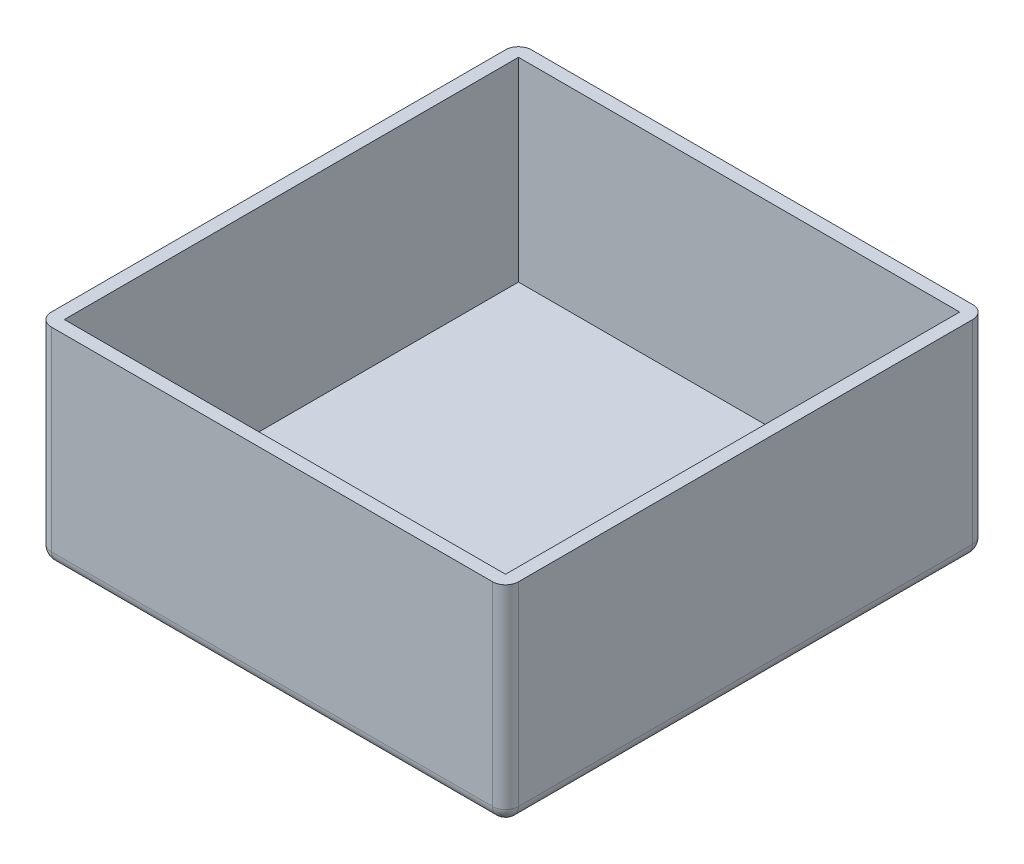
ISO-10303-21;
HEADER;
FILE_DESCRIPTION(('STEP AP214'),'2;1');
FILE_NAME('part.step','',(''),(''),'','','');
FILE_SCHEMA(('AUTOMOTIVE_DESIGN { 1 0 10303 214 1 1 1 1 }'));
ENDSEC;
DATA;
#1=APPLICATION_CONTEXT('core data for automotive mechanical design processes');
#2=APPLICATION_PROTOCOL_DEFINITION('international standard','automotive_design',2000,#1);
#3=PRODUCT_CONTEXT('',#1,'mechanical');
#4=PRODUCT('Part','Part','',(#3));
#5=PRODUCT_RELATED_PRODUCT_CATEGORY('part','',(#4));
#6=PRODUCT_DEFINITION_FORMATION('','',#4);
#7=PRODUCT_DEFINITION_CONTEXT('part definition',#1,'design');
#8=PRODUCT_DEFINITION('design','',#6,#7);
#9=PRODUCT_DEFINITION_SHAPE('','',#8);
#10=(LENGTH_UNIT() NAMED_UNIT(*) SI_UNIT(.MILLI.,.METRE.));
#11=(NAMED_UNIT(*) PLANE_ANGLE_UNIT() SI_UNIT($,.RADIAN.));
#12=(NAMED_UNIT(*) SI_UNIT($,.STERADIAN.) SOLID_ANGLE_UNIT());
#13=UNCERTAINTY_MEASURE_WITH_UNIT(LENGTH_MEASURE(1.E-05),#10,'distance_accuracy_value','');
#14=(GEOMETRIC_REPRESENTATION_CONTEXT(3) GLOBAL_UNCERTAINTY_ASSIGNED_CONTEXT((#13)) GLOBAL_UNIT_ASSIGNED_CONTEXT((#10,
#11,#12)) REPRESENTATION_CONTEXT('',''));
#15=CARTESIAN_POINT('',(0.,0.,0.));
#16=DIRECTION('',(0.,0.,1.));
#17=DIRECTION('',(1.,0.,0.));
#18=AXIS2_PLACEMENT_3D('',#15,#16,#17);
#19=CARTESIAN_POINT('',(-20.6822114521134,16.,-29.9549937691175));
#20=DIRECTION('',(1.,0.,0.));
#21=DIRECTION('',(0.,0.,-1.));
#22=AXIS2_PLACEMENT_3D('',#19,#20,#21);
#23=PLANE('',#22);
#24=DIRECTION('',(0.,0.,1.));
#25=VECTOR('',#24,1.);
#26=CARTESIAN_POINT('',(-20.6822114521134,1.,-29.9549937691175));
#27=LINE('',#26,#25);
#28=CARTESIAN_POINT('',(-20.6822114521134,1.,-28.9549937691175));
#29=VERTEX_POINT('',#28);
#30=CARTESIAN_POINT('',(-20.6822114521134,1.,6.04500623088252));
#31=VERTEX_POINT('',#30);
#32=EDGE_CURVE('E206',#29,#31,#27,.T.);
#33=ORIENTED_EDGE('',*,*,#32,.T.);
#34=DIRECTION('',(0.,-1.,0.));
#35=VECTOR('',#34,1.);
#36=CARTESIAN_POINT('',(-20.6822114521134,16.,6.04500623088252));
#37=LINE('',#36,#35);
#38=CARTESIAN_POINT('',(-20.6822114521134,16.,6.04500623088252));
#39=VERTEX_POINT('',#38);
#40=EDGE_CURVE('E208',#31,#39,#37,.F.);
#41=ORIENTED_EDGE('',*,*,#40,.T.);
#42=DIRECTION('',(0.,0.,1.));
#43=VECTOR('',#42,1.);
#44=CARTESIAN_POINT('',(-20.6822114521134,16.,-29.9549937691175));
#45=LINE('',#44,#43);
#46=CARTESIAN_POINT('',(-20.6822114521134,16.,-28.9549937691175));
#47=VERTEX_POINT('',#46);
#48=EDGE_CURVE('E173',#47,#39,#45,.T.);
#49=ORIENTED_EDGE('',*,*,#48,.F.);
#50=DIRECTION('',(0.,-1.,0.));
#51=VECTOR('',#50,1.);
#52=CARTESIAN_POINT('',(-20.6822114521134,16.,-28.9549937691175));
#53=LINE('',#52,#51);
#54=EDGE_CURVE('E204',#47,#29,#53,.T.);
#55=ORIENTED_EDGE('',*,*,#54,.T.);
#56=EDGE_LOOP('',(#33,#41,#49,#55));
#57=FACE_BOUND('',#56,.T.);
#58=ADVANCED_FACE('F33',(#57),#23,.F.);
#59=CARTESIAN_POINT('',(-20.6822114521134,16.,7.04500623088252));
#60=DIRECTION('',(0.,0.,-1.));
#61=DIRECTION('',(-1.,0.,0.));
#62=AXIS2_PLACEMENT_3D('',#59,#60,#61);
#63=PLANE('',#62);
#64=DIRECTION('',(1.,0.,0.));
#65=VECTOR('',#64,1.);
#66=CARTESIAN_POINT('',(-20.6822114521134,1.,7.04500623088252));
#67=LINE('',#66,#65);
#68=CARTESIAN_POINT('',(-19.6822114521134,1.,7.04500623088252));
#69=VERTEX_POINT('',#68);
#70=CARTESIAN_POINT('',(14.3177885478866,1.,7.04500623088252));
#71=VERTEX_POINT('',#70);
#72=EDGE_CURVE('E50',#69,#71,#67,.T.);
#73=ORIENTED_EDGE('',*,*,#72,.T.);
#74=DIRECTION('',(0.,-1.,0.));
#75=VECTOR('',#74,1.);
#76=CARTESIAN_POINT('',(14.3177885478866,16.,7.04500623088252));
#77=LINE('',#76,#75);
#78=CARTESIAN_POINT('',(14.3177885478866,16.,7.04500623088252));
#79=VERTEX_POINT('',#78);
#80=EDGE_CURVE('E218',#71,#79,#77,.F.);
#81=ORIENTED_EDGE('',*,*,#80,.T.);
#82=DIRECTION('',(1.,0.,0.));
#83=VECTOR('',#82,1.);
#84=CARTESIAN_POINT('',(-20.6822114521134,16.,7.04500623088252));
#85=LINE('',#84,#83);
#86=CARTESIAN_POINT('',(-19.6822114521134,16.,7.04500623088252));
#87=VERTEX_POINT('',#86);
#88=EDGE_CURVE('E179',#87,#79,#85,.T.);
#89=ORIENTED_EDGE('',*,*,#88,.F.);
#90=DIRECTION('',(0.,-1.,0.));
#91=VECTOR('',#90,1.);
#92=CARTESIAN_POINT('',(-19.6822114521134,16.,7.04500623088252));
#93=LINE('',#92,#91);
#94=EDGE_CURVE('E55',#87,#69,#93,.T.);
#95=ORIENTED_EDGE('',*,*,#94,.T.);
#96=EDGE_LOOP('',(#73,#81,#89,#95));
#97=FACE_BOUND('',#96,.T.);
#98=ADVANCED_FACE('F318',(#97),#63,.F.);
#99=CARTESIAN_POINT('',(15.3177885478866,16.,-29.9549937691175));
#100=DIRECTION('',(-1.,0.,0.));
#101=DIRECTION('',(0.,0.,1.));
#102=AXIS2_PLACEMENT_3D('',#99,#100,#101);
#103=PLANE('',#102);
#104=DIRECTION('',(0.,0.,-1.));
#105=VECTOR('',#104,1.);
#106=CARTESIAN_POINT('',(15.3177885478866,16.,-29.9549937691175));
#107=LINE('',#106,#105);
#108=CARTESIAN_POINT('',(15.3177885478866,16.,6.04500623088252));
#109=VERTEX_POINT('',#108);
#110=CARTESIAN_POINT('',(15.3177885478866,16.,-28.9549937691175));
#111=VERTEX_POINT('',#110);
#112=EDGE_CURVE('E182',#109,#111,#107,.T.);
#113=ORIENTED_EDGE('',*,*,#112,.F.);
#114=DIRECTION('',(0.,-1.,0.));
#115=VECTOR('',#114,1.);
#116=CARTESIAN_POINT('',(15.3177885478866,16.,6.04500623088252));
#117=LINE('',#116,#115);
#118=CARTESIAN_POINT('',(15.3177885478866,1.,6.04500623088252));
#119=VERTEX_POINT('',#118);
#120=EDGE_CURVE('E214',#109,#119,#117,.T.);
#121=ORIENTED_EDGE('',*,*,#120,.T.);
#122=DIRECTION('',(0.,0.,-1.));
#123=VECTOR('',#122,1.);
#124=CARTESIAN_POINT('',(15.3177885478866,1.,-29.9549937691175));
#125=LINE('',#124,#123);
#126=CARTESIAN_POINT('',(15.3177885478866,1.,-28.9549937691175));
#127=VERTEX_POINT('',#126);
#128=EDGE_CURVE('E212',#119,#127,#125,.T.);
#129=ORIENTED_EDGE('',*,*,#128,.T.);
#130=DIRECTION('',(0.,-1.,0.));
#131=VECTOR('',#130,1.);
#132=CARTESIAN_POINT('',(15.3177885478866,16.,-28.9549937691175));
#133=LINE('',#132,#131);
#134=EDGE_CURVE('E210',#127,#111,#133,.F.);
#135=ORIENTED_EDGE('',*,*,#134,.T.);
#136=EDGE_LOOP('',(#113,#121,#129,#135));
#137=FACE_BOUND('',#136,.T.);
#138=ADVANCED_FACE('F270',(#137),#103,.F.);
#139=CARTESIAN_POINT('',(-20.6822114521134,16.,-29.9549937691175));
#140=DIRECTION('',(0.,0.,1.));
#141=DIRECTION('',(1.,0.,0.));
#142=AXIS2_PLACEMENT_3D('',#139,#140,#141);
#143=PLANE('',#142);
#144=DIRECTION('',(-1.,0.,0.));
#145=VECTOR('',#144,1.);
#146=CARTESIAN_POINT('',(-20.6822114521134,16.,-29.9549937691175));
#147=LINE('',#146,#145);
#148=CARTESIAN_POINT('',(14.3177885478866,16.,-29.9549937691175));
#149=VERTEX_POINT('',#148);
#150=CARTESIAN_POINT('',(-19.6822114521134,16.,-29.9549937691175));
#151=VERTEX_POINT('',#150);
#152=EDGE_CURVE('E185',#149,#151,#147,.T.);
#153=ORIENTED_EDGE('',*,*,#152,.F.);
#154=DIRECTION('',(0.,-1.,0.));
#155=VECTOR('',#154,1.);
#156=CARTESIAN_POINT('',(14.3177885478866,16.,-29.9549937691175));
#157=LINE('',#156,#155);
#158=CARTESIAN_POINT('',(14.3177885478866,1.,-29.9549937691175));
#159=VERTEX_POINT('',#158);
#160=EDGE_CURVE('E193',#149,#159,#157,.T.);
#161=ORIENTED_EDGE('',*,*,#160,.T.);
#162=DIRECTION('',(-1.,0.,0.));
#163=VECTOR('',#162,1.);
#164=CARTESIAN_POINT('',(-20.6822114521134,1.,-29.9549937691175));
#165=LINE('',#164,#163);
#166=CARTESIAN_POINT('',(-19.6822114521134,1.,-29.9549937691175));
#167=VERTEX_POINT('',#166);
#168=EDGE_CURVE('E190',#159,#167,#165,.T.);
#169=ORIENTED_EDGE('',*,*,#168,.T.);
#170=DIRECTION('',(0.,-1.,0.));
#171=VECTOR('',#170,1.);
#172=CARTESIAN_POINT('',(-19.6822114521134,16.,-29.9549937691175));
#173=LINE('',#172,#171);
#174=EDGE_CURVE('E188',#167,#151,#173,.F.);
#175=ORIENTED_EDGE('',*,*,#174,.T.);
#176=EDGE_LOOP('',(#153,#161,#169,#175));
#177=FACE_BOUND('',#176,.T.);
#178=ADVANCED_FACE('F283',(#177),#143,.F.);
#179=CARTESIAN_POINT('',(0.,16.,0.));
#180=DIRECTION('',(0.,1.,0.));
#181=DIRECTION('',(0.,0.,1.));
#182=AXIS2_PLACEMENT_3D('',#179,#180,#181);
#183=PLANE('',#182);
#184=DIRECTION('',(0.,0.,1.));
#185=VECTOR('',#184,1.);
#186=CARTESIAN_POINT('',(-19.6822114521134,16.,-28.9549937691175));
#187=LINE('',#186,#185);
#188=CARTESIAN_POINT('',(-19.6822114521134,16.,-28.9549937691175));
#189=VERTEX_POINT('',#188);
#190=CARTESIAN_POINT('',(-19.6822114521134,16.,6.04500623088253));
#191=VERTEX_POINT('',#190);
#192=EDGE_CURVE('E141',#189,#191,#187,.T.);
#193=ORIENTED_EDGE('',*,*,#192,.F.);
#194=DIRECTION('',(-1.,0.,0.));
#195=VECTOR('',#194,1.);
#196=CARTESIAN_POINT('',(-19.6822114521134,16.,-28.9549937691175));
#197=LINE('',#196,#195);
#198=CARTESIAN_POINT('',(14.3177885478866,16.,-28.9549937691175));
#199=VERTEX_POINT('',#198);
#200=EDGE_CURVE('E158',#199,#189,#197,.T.);
#201=ORIENTED_EDGE('',*,*,#200,.F.);
#202=DIRECTION('',(0.,0.,-1.));
#203=VECTOR('',#202,1.);
#204=CARTESIAN_POINT('',(14.3177885478866,16.,-28.9549937691175));
#205=LINE('',#204,#203);
#206=CARTESIAN_POINT('',(14.3177885478866,16.,6.04500623088253));
#207=VERTEX_POINT('',#206);
#208=EDGE_CURVE('E161',#207,#199,#205,.T.);
#209=ORIENTED_EDGE('',*,*,#208,.F.);
#210=DIRECTION('',(1.,0.,0.));
#211=VECTOR('',#210,1.);
#212=CARTESIAN_POINT('',(-19.6822114521134,16.,6.04500623088253));
#213=LINE('',#212,#211);
#214=EDGE_CURVE('E167',#191,#207,#213,.T.);
#215=ORIENTED_EDGE('',*,*,#214,.F.);
#216=EDGE_LOOP('',(#193,#201,#209,#215));
#217=FACE_BOUND('',#216,.T.);
#218=ORIENTED_EDGE('',*,*,#88,.T.);
#219=CARTESIAN_POINT('',(14.3177885478866,16.,6.04500623088252));
#220=DIRECTION('',(0.,1.,0.));
#221=DIRECTION('',(0.,0.,1.));
#222=AXIS2_PLACEMENT_3D('',#219,#220,#221);
#223=CIRCLE('',#222,1.);
#224=EDGE_CURVE('E11',#79,#109,#223,.T.);
#225=ORIENTED_EDGE('',*,*,#224,.T.);
#226=ORIENTED_EDGE('',*,*,#112,.T.);
#227=CARTESIAN_POINT('',(14.3177885478866,16.,-28.9549937691175));
#228=DIRECTION('',(0.,1.,0.));
#229=DIRECTION('',(0.,0.,1.));
#230=AXIS2_PLACEMENT_3D('',#227,#228,#229);
#231=CIRCLE('',#230,1.);
#232=EDGE_CURVE('E222',#111,#149,#231,.T.);
#233=ORIENTED_EDGE('',*,*,#232,.T.);
#234=ORIENTED_EDGE('',*,*,#152,.T.);
#235=CARTESIAN_POINT('',(-19.6822114521134,16.,-28.9549937691175));
#236=DIRECTION('',(0.,1.,0.));
#237=DIRECTION('',(0.,0.,1.));
#238=AXIS2_PLACEMENT_3D('',#235,#236,#237);
#239=CIRCLE('',#238,1.);
#240=EDGE_CURVE('E220',#151,#47,#239,.T.);
#241=ORIENTED_EDGE('',*,*,#240,.T.);
#242=ORIENTED_EDGE('',*,*,#48,.T.);
#243=CARTESIAN_POINT('',(-19.6822114521134,16.,6.04500623088252));
#244=DIRECTION('',(0.,1.,0.));
#245=DIRECTION('',(0.,0.,1.));
#246=AXIS2_PLACEMENT_3D('',#243,#244,#245);
#247=CIRCLE('',#246,1.);
#248=EDGE_CURVE('E42',#39,#87,#247,.T.);
#249=ORIENTED_EDGE('',*,*,#248,.T.);
#250=EDGE_LOOP('',(#218,#225,#226,#233,#234,#241,#242,#249));
#251=FACE_BOUND('',#250,.T.);
#252=ADVANCED_FACE('F280',(#217,#251),#183,.T.);
#253=CARTESIAN_POINT('',(0.,0.,0.));
#254=DIRECTION('',(0.,1.,0.));
#255=DIRECTION('',(0.,0.,1.));
#256=AXIS2_PLACEMENT_3D('',#253,#254,#255);
#257=PLANE('',#256);
#258=DIRECTION('',(0.,0.,1.));
#259=VECTOR('',#258,1.);
#260=CARTESIAN_POINT('',(-19.6822114521134,0.,0.));
#261=LINE('',#260,#259);
#262=CARTESIAN_POINT('',(-19.6822114521134,0.,6.04500623088252));
#263=VERTEX_POINT('',#262);
#264=CARTESIAN_POINT('',(-19.6822114521134,0.,-28.9549937691175));
#265=VERTEX_POINT('',#264);
#266=EDGE_CURVE('E199',#263,#265,#261,.F.);
#267=ORIENTED_EDGE('',*,*,#266,.T.);
#268=DIRECTION('',(-1.,0.,0.));
#269=VECTOR('',#268,1.);
#270=CARTESIAN_POINT('',(0.,0.,-28.9549937691175));
#271=LINE('',#270,#269);
#272=CARTESIAN_POINT('',(14.3177885478866,0.,-28.9549937691175));
#273=VERTEX_POINT('',#272);
#274=EDGE_CURVE('E201',#265,#273,#271,.F.);
#275=ORIENTED_EDGE('',*,*,#274,.T.);
#276=DIRECTION('',(0.,0.,-1.));
#277=VECTOR('',#276,1.);
#278=CARTESIAN_POINT('',(14.3177885478866,0.,0.));
#279=LINE('',#278,#277);
#280=CARTESIAN_POINT('',(14.3177885478866,0.,6.04500623088252));
#281=VERTEX_POINT('',#280);
#282=EDGE_CURVE('E197',#273,#281,#279,.F.);
#283=ORIENTED_EDGE('',*,*,#282,.T.);
#284=DIRECTION('',(1.,0.,0.));
#285=VECTOR('',#284,1.);
#286=CARTESIAN_POINT('',(0.,0.,6.04500623088252));
#287=LINE('',#286,#285);
#288=EDGE_CURVE('E195',#281,#263,#287,.F.);
#289=ORIENTED_EDGE('',*,*,#288,.T.);
#290=EDGE_LOOP('',(#267,#275,#283,#289));
#291=FACE_BOUND('',#290,.T.);
#292=ADVANCED_FACE('F308',(#291),#257,.F.);
#293=CARTESIAN_POINT('',(-19.6822114521134,1.,-28.9549937691175));
#294=DIRECTION('',(-1.,0.,0.));
#295=DIRECTION('',(0.,0.,1.));
#296=AXIS2_PLACEMENT_3D('',#293,#294,#295);
#297=PLANE('',#296);
#298=ORIENTED_EDGE('',*,*,#192,.T.);
#299=DIRECTION('',(0.,1.,0.));
#300=VECTOR('',#299,1.);
#301=CARTESIAN_POINT('',(-19.6822114521134,1.,6.04500623088253));
#302=LINE('',#301,#300);
#303=CARTESIAN_POINT('',(-19.6822114521134,1.,6.04500623088253));
#304=VERTEX_POINT('',#303);
#305=EDGE_CURVE('E134',#304,#191,#302,.T.);
#306=ORIENTED_EDGE('',*,*,#305,.F.);
#307=DIRECTION('',(0.,0.,1.));
#308=VECTOR('',#307,1.);
#309=CARTESIAN_POINT('',(-19.6822114521134,1.,-28.9549937691175));
#310=LINE('',#309,#308);
#311=CARTESIAN_POINT('',(-19.6822114521134,1.,-28.9549937691175));
#312=VERTEX_POINT('',#311);
#313=EDGE_CURVE('E138',#312,#304,#310,.T.);
#314=ORIENTED_EDGE('',*,*,#313,.F.);
#315=DIRECTION('',(0.,1.,0.));
#316=VECTOR('',#315,1.);
#317=CARTESIAN_POINT('',(-19.6822114521134,1.,-28.9549937691175));
#318=LINE('',#317,#316);
#319=EDGE_CURVE('E171',#312,#189,#318,.T.);
#320=ORIENTED_EDGE('',*,*,#319,.T.);
#321=EDGE_LOOP('',(#298,#306,#314,#320));
#322=FACE_BOUND('',#321,.T.);
#323=ADVANCED_FACE('F136',(#322),#297,.F.);
#324=CARTESIAN_POINT('',(-19.6822114521134,1.,-28.9549937691175));
#325=DIRECTION('',(0.,0.,-1.));
#326=DIRECTION('',(-1.,0.,0.));
#327=AXIS2_PLACEMENT_3D('',#324,#325,#326);
#328=PLANE('',#327);
#329=ORIENTED_EDGE('',*,*,#200,.T.);
#330=ORIENTED_EDGE('',*,*,#319,.F.);
#331=DIRECTION('',(-1.,0.,0.));
#332=VECTOR('',#331,1.);
#333=CARTESIAN_POINT('',(-19.6822114521134,1.,-28.9549937691175));
#334=LINE('',#333,#332);
#335=CARTESIAN_POINT('',(14.3177885478866,1.,-28.9549937691175));
#336=VERTEX_POINT('',#335);
#337=EDGE_CURVE('E146',#336,#312,#334,.T.);
#338=ORIENTED_EDGE('',*,*,#337,.F.);
#339=DIRECTION('',(0.,1.,0.));
#340=VECTOR('',#339,1.);
#341=CARTESIAN_POINT('',(14.3177885478866,1.,-28.9549937691175));
#342=LINE('',#341,#340);
#343=EDGE_CURVE('E174',#336,#199,#342,.T.);
#344=ORIENTED_EDGE('',*,*,#343,.T.);
#345=EDGE_LOOP('',(#329,#330,#338,#344));
#346=FACE_BOUND('',#345,.T.);
#347=ADVANCED_FACE('F439',(#346),#328,.F.);
#348=CARTESIAN_POINT('',(14.3177885478866,1.,-28.9549937691175));
#349=DIRECTION('',(1.,0.,0.));
#350=DIRECTION('',(0.,0.,-1.));
#351=AXIS2_PLACEMENT_3D('',#348,#349,#350);
#352=PLANE('',#351);
#353=ORIENTED_EDGE('',*,*,#208,.T.);
#354=ORIENTED_EDGE('',*,*,#343,.F.);
#355=DIRECTION('',(0.,0.,-1.));
#356=VECTOR('',#355,1.);
#357=CARTESIAN_POINT('',(14.3177885478866,1.,-28.9549937691175));
#358=LINE('',#357,#356);
#359=CARTESIAN_POINT('',(14.3177885478866,1.,6.04500623088253));
#360=VERTEX_POINT('',#359);
#361=EDGE_CURVE('E154',#360,#336,#358,.T.);
#362=ORIENTED_EDGE('',*,*,#361,.F.);
#363=DIRECTION('',(0.,1.,0.));
#364=VECTOR('',#363,1.);
#365=CARTESIAN_POINT('',(14.3177885478866,1.,6.04500623088253));
#366=LINE('',#365,#364);
#367=EDGE_CURVE('E145',#360,#207,#366,.T.);
#368=ORIENTED_EDGE('',*,*,#367,.T.);
#369=EDGE_LOOP('',(#353,#354,#362,#368));
#370=FACE_BOUND('',#369,.T.);
#371=ADVANCED_FACE('F431',(#370),#352,.F.);
#372=CARTESIAN_POINT('',(-19.6822114521134,1.,6.04500623088253));
#373=DIRECTION('',(0.,0.,1.));
#374=DIRECTION('',(1.,0.,0.));
#375=AXIS2_PLACEMENT_3D('',#372,#373,#374);
#376=PLANE('',#375);
#377=ORIENTED_EDGE('',*,*,#214,.T.);
#378=ORIENTED_EDGE('',*,*,#367,.F.);
#379=DIRECTION('',(1.,0.,0.));
#380=VECTOR('',#379,1.);
#381=CARTESIAN_POINT('',(-19.6822114521134,1.,6.04500623088253));
#382=LINE('',#381,#380);
#383=EDGE_CURVE('E149',#304,#360,#382,.T.);
#384=ORIENTED_EDGE('',*,*,#383,.F.);
#385=ORIENTED_EDGE('',*,*,#305,.T.);
#386=EDGE_LOOP('',(#377,#378,#384,#385));
#387=FACE_BOUND('',#386,.T.);
#388=ADVANCED_FACE('F150',(#387),#376,.F.);
#389=CARTESIAN_POINT('',(0.,1.,0.));
#390=DIRECTION('',(0.,1.,0.));
#391=DIRECTION('',(0.,0.,1.));
#392=AXIS2_PLACEMENT_3D('',#389,#390,#391);
#393=PLANE('',#392);
#394=ORIENTED_EDGE('',*,*,#313,.T.);
#395=ORIENTED_EDGE('',*,*,#383,.T.);
#396=ORIENTED_EDGE('',*,*,#361,.T.);
#397=ORIENTED_EDGE('',*,*,#337,.T.);
#398=EDGE_LOOP('',(#394,#395,#396,#397));
#399=FACE_BOUND('',#398,.T.);
#400=ADVANCED_FACE('F156',(#399),#393,.T.);
#401=CARTESIAN_POINT('',(14.3177885478866,16.,6.04500623088252));
#402=DIRECTION('',(0.,-1.,0.));
#403=DIRECTION('',(0.,0.,-1.));
#404=AXIS2_PLACEMENT_3D('',#401,#402,#403);
#405=CYLINDRICAL_SURFACE('',#404,1.);
#406=ORIENTED_EDGE('',*,*,#224,.F.);
#407=ORIENTED_EDGE('',*,*,#80,.F.);
#408=CARTESIAN_POINT('',(14.3177885478866,1.,6.04500623088252));
#409=DIRECTION('',(0.,-1.,0.));
#410=DIRECTION('',(0.,0.,-1.));
#411=AXIS2_PLACEMENT_3D('',#408,#409,#410);
#412=CIRCLE('',#411,1.);
#413=EDGE_CURVE('E252',#119,#71,#412,.T.);
#414=ORIENTED_EDGE('',*,*,#413,.F.);
#415=ORIENTED_EDGE('',*,*,#120,.F.);
#416=EDGE_LOOP('',(#406,#407,#414,#415));
#417=FACE_BOUND('',#416,.T.);
#418=ADVANCED_FACE('F35',(#417),#405,.T.);
#419=CARTESIAN_POINT('',(-19.6822114521134,16.,6.04500623088252));
#420=DIRECTION('',(0.,-1.,0.));
#421=DIRECTION('',(0.,0.,-1.));
#422=AXIS2_PLACEMENT_3D('',#419,#420,#421);
#423=CYLINDRICAL_SURFACE('',#422,1.);
#424=ORIENTED_EDGE('',*,*,#248,.F.);
#425=ORIENTED_EDGE('',*,*,#40,.F.);
#426=CARTESIAN_POINT('',(-19.6822114521134,1.,6.04500623088252));
#427=DIRECTION('',(0.,-1.,0.));
#428=DIRECTION('',(0.,0.,-1.));
#429=AXIS2_PLACEMENT_3D('',#426,#427,#428);
#430=CIRCLE('',#429,1.);
#431=EDGE_CURVE('E250',#69,#31,#430,.T.);
#432=ORIENTED_EDGE('',*,*,#431,.F.);
#433=ORIENTED_EDGE('',*,*,#94,.F.);
#434=EDGE_LOOP('',(#424,#425,#432,#433));
#435=FACE_BOUND('',#434,.T.);
#436=ADVANCED_FACE('F297',(#435),#423,.T.);
#437=CARTESIAN_POINT('',(-20.6822114521134,1.,6.04500623088252));
#438=DIRECTION('',(1.,0.,0.));
#439=DIRECTION('',(0.,0.,-1.));
#440=AXIS2_PLACEMENT_3D('',#437,#438,#439);
#441=CYLINDRICAL_SURFACE('',#440,1.);
#442=CARTESIAN_POINT('',(14.3177885478866,1.,6.04500623088252));
#443=DIRECTION('',(1.,0.,0.));
#444=DIRECTION('',(0.,0.,-1.));
#445=AXIS2_PLACEMENT_3D('',#442,#443,#444);
#446=CIRCLE('',#445,1.);
#447=EDGE_CURVE('E37',#71,#281,#446,.T.);
#448=ORIENTED_EDGE('',*,*,#447,.F.);
#449=ORIENTED_EDGE('',*,*,#72,.F.);
#450=CARTESIAN_POINT('',(-19.6822114521134,1.,6.04500623088252));
#451=DIRECTION('',(-1.,0.,0.));
#452=DIRECTION('',(0.,0.,1.));
#453=AXIS2_PLACEMENT_3D('',#450,#451,#452);
#454=CIRCLE('',#453,1.);
#455=EDGE_CURVE('E247',#263,#69,#454,.T.);
#456=ORIENTED_EDGE('',*,*,#455,.F.);
#457=ORIENTED_EDGE('',*,*,#288,.F.);
#458=EDGE_LOOP('',(#448,#449,#456,#457));
#459=FACE_BOUND('',#458,.T.);
#460=ADVANCED_FACE('F309',(#459),#441,.T.);
#461=CARTESIAN_POINT('',(14.3177885478866,1.,6.04500623088252));
#462=DIRECTION('',(0.,0.,1.));
#463=DIRECTION('',(1.,0.,0.));
#464=AXIS2_PLACEMENT_3D('',#461,#462,#463);
#465=SPHERICAL_SURFACE('',#464,1.);
#466=ORIENTED_EDGE('',*,*,#413,.T.);
#467=ORIENTED_EDGE('',*,*,#447,.T.);
#468=CARTESIAN_POINT('',(14.3177885478866,1.,6.04500623088252));
#469=DIRECTION('',(0.,0.,1.));
#470=DIRECTION('',(1.,0.,0.));
#471=AXIS2_PLACEMENT_3D('',#468,#469,#470);
#472=CIRCLE('',#471,1.);
#473=EDGE_CURVE('E244',#119,#281,#472,.F.);
#474=ORIENTED_EDGE('',*,*,#473,.F.);
#475=EDGE_LOOP('',(#466,#467,#474));
#476=FACE_BOUND('',#475,.T.);
#477=ADVANCED_FACE('F259',(#476),#465,.T.);
#478=CARTESIAN_POINT('',(-19.6822114521134,1.,6.04500623088252));
#479=DIRECTION('',(0.,0.,1.));
#480=DIRECTION('',(1.,0.,0.));
#481=AXIS2_PLACEMENT_3D('',#478,#479,#480);
#482=SPHERICAL_SURFACE('',#481,1.);
#483=ORIENTED_EDGE('',*,*,#455,.T.);
#484=ORIENTED_EDGE('',*,*,#431,.T.);
#485=CARTESIAN_POINT('',(-19.6822114521134,1.,6.04500623088252));
#486=DIRECTION('',(0.,0.,1.));
#487=DIRECTION('',(1.,0.,0.));
#488=AXIS2_PLACEMENT_3D('',#485,#486,#487);
#489=CIRCLE('',#488,1.);
#490=EDGE_CURVE('E241',#263,#31,#489,.F.);
#491=ORIENTED_EDGE('',*,*,#490,.F.);
#492=EDGE_LOOP('',(#483,#484,#491));
#493=FACE_BOUND('',#492,.T.);
#494=ADVANCED_FACE('F300',(#493),#482,.T.);
#495=CARTESIAN_POINT('',(14.3177885478866,1.,-29.9549937691175));
#496=DIRECTION('',(0.,0.,-1.));
#497=DIRECTION('',(-1.,0.,0.));
#498=AXIS2_PLACEMENT_3D('',#495,#496,#497);
#499=CYLINDRICAL_SURFACE('',#498,1.);
#500=ORIENTED_EDGE('',*,*,#473,.T.);
#501=ORIENTED_EDGE('',*,*,#282,.F.);
#502=CARTESIAN_POINT('',(14.3177885478866,1.,-28.9549937691175));
#503=DIRECTION('',(0.,0.,-1.));
#504=DIRECTION('',(-1.,0.,0.));
#505=AXIS2_PLACEMENT_3D('',#502,#503,#504);
#506=CIRCLE('',#505,1.);
#507=EDGE_CURVE('E238',#127,#273,#506,.T.);
#508=ORIENTED_EDGE('',*,*,#507,.F.);
#509=ORIENTED_EDGE('',*,*,#128,.F.);
#510=EDGE_LOOP('',(#500,#501,#508,#509));
#511=FACE_BOUND('',#510,.T.);
#512=ADVANCED_FACE('F265',(#511),#499,.T.);
#513=CARTESIAN_POINT('',(14.3177885478866,16.,-28.9549937691175));
#514=DIRECTION('',(0.,-1.,0.));
#515=DIRECTION('',(0.,0.,-1.));
#516=AXIS2_PLACEMENT_3D('',#513,#514,#515);
#517=CYLINDRICAL_SURFACE('',#516,1.);
#518=ORIENTED_EDGE('',*,*,#232,.F.);
#519=ORIENTED_EDGE('',*,*,#134,.F.);
#520=CARTESIAN_POINT('',(14.3177885478866,1.,-28.9549937691175));
#521=DIRECTION('',(0.,-1.,0.));
#522=DIRECTION('',(0.,0.,-1.));
#523=AXIS2_PLACEMENT_3D('',#520,#521,#522);
#524=CIRCLE('',#523,1.);
#525=EDGE_CURVE('E235',#159,#127,#524,.T.);
#526=ORIENTED_EDGE('',*,*,#525,.F.);
#527=ORIENTED_EDGE('',*,*,#160,.F.);
#528=EDGE_LOOP('',(#518,#519,#526,#527));
#529=FACE_BOUND('',#528,.T.);
#530=ADVANCED_FACE('F275',(#529),#517,.T.);
#531=CARTESIAN_POINT('',(-19.6822114521134,16.,-28.9549937691175));
#532=DIRECTION('',(0.,-1.,0.));
#533=DIRECTION('',(0.,0.,-1.));
#534=AXIS2_PLACEMENT_3D('',#531,#532,#533);
#535=CYLINDRICAL_SURFACE('',#534,1.);
#536=ORIENTED_EDGE('',*,*,#240,.F.);
#537=ORIENTED_EDGE('',*,*,#174,.F.);
#538=CARTESIAN_POINT('',(-19.6822114521134,1.,-28.9549937691175));
#539=DIRECTION('',(0.,-1.,0.));
#540=DIRECTION('',(0.,0.,-1.));
#541=AXIS2_PLACEMENT_3D('',#538,#539,#540);
#542=CIRCLE('',#541,1.);
#543=EDGE_CURVE('E232',#29,#167,#542,.T.);
#544=ORIENTED_EDGE('',*,*,#543,.F.);
#545=ORIENTED_EDGE('',*,*,#54,.F.);
#546=EDGE_LOOP('',(#536,#537,#544,#545));
#547=FACE_BOUND('',#546,.T.);
#548=ADVANCED_FACE('F288',(#547),#535,.T.);
#549=CARTESIAN_POINT('',(-19.6822114521134,1.,-29.9549937691175));
#550=DIRECTION('',(0.,0.,1.));
#551=DIRECTION('',(1.,0.,0.));
#552=AXIS2_PLACEMENT_3D('',#549,#550,#551);
#553=CYLINDRICAL_SURFACE('',#552,1.);
#554=ORIENTED_EDGE('',*,*,#490,.T.);
#555=ORIENTED_EDGE('',*,*,#32,.F.);
#556=CARTESIAN_POINT('',(-19.6822114521134,1.,-28.9549937691175));
#557=DIRECTION('',(0.,0.,-1.));
#558=DIRECTION('',(-1.,0.,0.));
#559=AXIS2_PLACEMENT_3D('',#556,#557,#558);
#560=CIRCLE('',#559,1.);
#561=EDGE_CURVE('E229',#265,#29,#560,.T.);
#562=ORIENTED_EDGE('',*,*,#561,.F.);
#563=ORIENTED_EDGE('',*,*,#266,.F.);
#564=EDGE_LOOP('',(#554,#555,#562,#563));
#565=FACE_BOUND('',#564,.T.);
#566=ADVANCED_FACE('F304',(#565),#553,.T.);
#567=CARTESIAN_POINT('',(14.3177885478866,1.,-28.9549937691175));
#568=DIRECTION('',(0.,0.,1.));
#569=DIRECTION('',(1.,0.,0.));
#570=AXIS2_PLACEMENT_3D('',#567,#568,#569);
#571=SPHERICAL_SURFACE('',#570,1.);
#572=ORIENTED_EDGE('',*,*,#525,.T.);
#573=ORIENTED_EDGE('',*,*,#507,.T.);
#574=CARTESIAN_POINT('',(14.3177885478866,1.,-28.9549937691175));
#575=DIRECTION('',(1.,0.,0.));
#576=DIRECTION('',(0.,0.,-1.));
#577=AXIS2_PLACEMENT_3D('',#574,#575,#576);
#578=CIRCLE('',#577,1.);
#579=EDGE_CURVE('E227',#159,#273,#578,.F.);
#580=ORIENTED_EDGE('',*,*,#579,.F.);
#581=EDGE_LOOP('',(#572,#573,#580));
#582=FACE_BOUND('',#581,.T.);
#583=ADVANCED_FACE('F333',(#582),#571,.T.);
#584=CARTESIAN_POINT('',(-19.6822114521134,1.,-28.9549937691175));
#585=DIRECTION('',(0.,0.,1.));
#586=DIRECTION('',(1.,0.,0.));
#587=AXIS2_PLACEMENT_3D('',#584,#585,#586);
#588=SPHERICAL_SURFACE('',#587,1.);
#589=ORIENTED_EDGE('',*,*,#561,.T.);
#590=ORIENTED_EDGE('',*,*,#543,.T.);
#591=CARTESIAN_POINT('',(-19.6822114521134,1.,-28.9549937691175));
#592=DIRECTION('',(-1.,0.,0.));
#593=DIRECTION('',(0.,0.,1.));
#594=AXIS2_PLACEMENT_3D('',#591,#592,#593);
#595=CIRCLE('',#594,1.);
#596=EDGE_CURVE('E225',#265,#167,#595,.F.);
#597=ORIENTED_EDGE('',*,*,#596,.F.);
#598=EDGE_LOOP('',(#589,#590,#597));
#599=FACE_BOUND('',#598,.T.);
#600=ADVANCED_FACE('F329',(#599),#588,.T.);
#601=CARTESIAN_POINT('',(-20.6822114521134,1.,-28.9549937691175));
#602=DIRECTION('',(-1.,0.,0.));
#603=DIRECTION('',(0.,0.,1.));
#604=AXIS2_PLACEMENT_3D('',#601,#602,#603);
#605=CYLINDRICAL_SURFACE('',#604,1.);
#606=ORIENTED_EDGE('',*,*,#579,.T.);
#607=ORIENTED_EDGE('',*,*,#274,.F.);
#608=ORIENTED_EDGE('',*,*,#596,.T.);
#609=ORIENTED_EDGE('',*,*,#168,.F.);
#610=EDGE_LOOP('',(#606,#607,#608,#609));
#611=FACE_BOUND('',#610,.T.);
#612=ADVANCED_FACE('F326',(#611),#605,.T.);
#613=CLOSED_SHELL('',(#58,#98,#138,#178,#252,#292,#323,#347,#371,#388,#400,#418,#436,#460,#477,
#494,#512,#530,#548,#566,#583,#600,#612));
#614=MANIFOLD_SOLID_BREP('B2',#613);
#615=ADVANCED_BREP_SHAPE_REPRESENTATION('',(#18,#614),#14);
#616=SHAPE_DEFINITION_REPRESENTATION(#9,#615);
ENDSEC;
END-ISO-10303-21;
